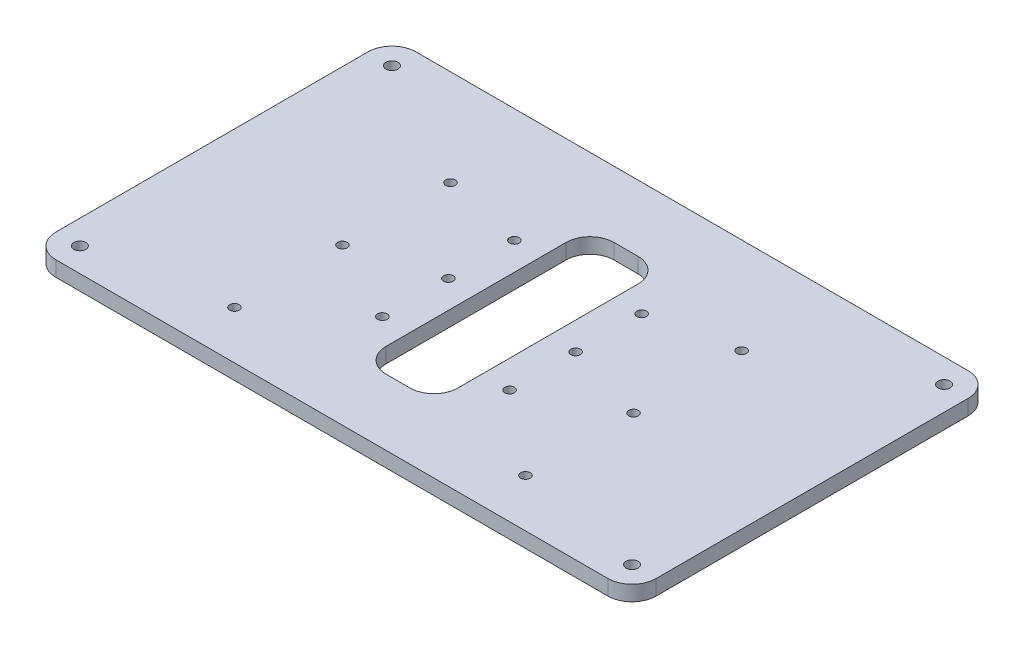
ISO-10303-21;
HEADER;
FILE_DESCRIPTION(('STEP AP214'),'2;1');
FILE_NAME('part.step','',(''),(''),'','','');
FILE_SCHEMA(('AUTOMOTIVE_DESIGN { 1 0 10303 214 1 1 1 1 }'));
ENDSEC;
DATA;
#1=APPLICATION_CONTEXT('core data for automotive mechanical design processes');
#2=APPLICATION_PROTOCOL_DEFINITION('international standard','automotive_design',2000,#1);
#3=PRODUCT_CONTEXT('',#1,'mechanical');
#4=PRODUCT('Part','Part','',(#3));
#5=PRODUCT_RELATED_PRODUCT_CATEGORY('part','',(#4));
#6=PRODUCT_DEFINITION_FORMATION('','',#4);
#7=PRODUCT_DEFINITION_CONTEXT('part definition',#1,'design');
#8=PRODUCT_DEFINITION('design','',#6,#7);
#9=PRODUCT_DEFINITION_SHAPE('','',#8);
#10=(LENGTH_UNIT() NAMED_UNIT(*) SI_UNIT(.MILLI.,.METRE.));
#11=(NAMED_UNIT(*) PLANE_ANGLE_UNIT() SI_UNIT($,.RADIAN.));
#12=(NAMED_UNIT(*) SI_UNIT($,.STERADIAN.) SOLID_ANGLE_UNIT());
#13=UNCERTAINTY_MEASURE_WITH_UNIT(LENGTH_MEASURE(1.E-05),#10,'distance_accuracy_value','');
#14=(GEOMETRIC_REPRESENTATION_CONTEXT(3) GLOBAL_UNCERTAINTY_ASSIGNED_CONTEXT((#13)) GLOBAL_UNIT_ASSIGNED_CONTEXT((#10,
#11,#12)) REPRESENTATION_CONTEXT('',''));
#15=CARTESIAN_POINT('',(0.,0.,0.));
#16=DIRECTION('',(0.,0.,1.));
#17=DIRECTION('',(1.,0.,0.));
#18=AXIS2_PLACEMENT_3D('',#15,#16,#17);
#19=CARTESIAN_POINT('',(-125.,6.35,-75.));
#20=DIRECTION('',(1.,0.,0.));
#21=DIRECTION('',(0.,0.,-1.));
#22=AXIS2_PLACEMENT_3D('',#19,#20,#21);
#23=PLANE('',#22);
#24=DIRECTION('',(0.,0.,1.));
#25=VECTOR('',#24,1.);
#26=CARTESIAN_POINT('',(-125.,0.,-75.));
#27=LINE('',#26,#25);
#28=CARTESIAN_POINT('',(-125.,0.,-65.));
#29=VERTEX_POINT('',#28);
#30=CARTESIAN_POINT('',(-125.,0.,65.));
#31=VERTEX_POINT('',#30);
#32=EDGE_CURVE('E195',#29,#31,#27,.T.);
#33=ORIENTED_EDGE('',*,*,#32,.T.);
#34=DIRECTION('',(0.,-1.,0.));
#35=VECTOR('',#34,1.);
#36=CARTESIAN_POINT('',(-125.,6.35,65.));
#37=LINE('',#36,#35);
#38=CARTESIAN_POINT('',(-125.,6.35,65.));
#39=VERTEX_POINT('',#38);
#40=EDGE_CURVE('E235',#31,#39,#37,.F.);
#41=ORIENTED_EDGE('',*,*,#40,.T.);
#42=DIRECTION('',(0.,0.,1.));
#43=VECTOR('',#42,1.);
#44=CARTESIAN_POINT('',(-125.,6.35,-75.));
#45=LINE('',#44,#43);
#46=CARTESIAN_POINT('',(-125.,6.35,-65.));
#47=VERTEX_POINT('',#46);
#48=EDGE_CURVE('E184',#47,#39,#45,.T.);
#49=ORIENTED_EDGE('',*,*,#48,.F.);
#50=DIRECTION('',(0.,-1.,0.));
#51=VECTOR('',#50,1.);
#52=CARTESIAN_POINT('',(-125.,6.35,-65.));
#53=LINE('',#52,#51);
#54=EDGE_CURVE('E232',#47,#29,#53,.T.);
#55=ORIENTED_EDGE('',*,*,#54,.T.);
#56=EDGE_LOOP('',(#33,#41,#49,#55));
#57=FACE_BOUND('',#56,.T.);
#58=ADVANCED_FACE('F33',(#57),#23,.F.);
#59=CARTESIAN_POINT('',(-125.,6.35,75.));
#60=DIRECTION('',(0.,0.,-1.));
#61=DIRECTION('',(-1.,0.,0.));
#62=AXIS2_PLACEMENT_3D('',#59,#60,#61);
#63=PLANE('',#62);
#64=DIRECTION('',(1.,0.,0.));
#65=VECTOR('',#64,1.);
#66=CARTESIAN_POINT('',(-125.,6.35,75.));
#67=LINE('',#66,#65);
#68=CARTESIAN_POINT('',(-115.,6.35,75.));
#69=VERTEX_POINT('',#68);
#70=CARTESIAN_POINT('',(115.,6.35,75.));
#71=VERTEX_POINT('',#70);
#72=EDGE_CURVE('E187',#69,#71,#67,.T.);
#73=ORIENTED_EDGE('',*,*,#72,.F.);
#74=DIRECTION('',(0.,-1.,0.));
#75=VECTOR('',#74,1.);
#76=CARTESIAN_POINT('',(-115.,6.35,75.));
#77=LINE('',#76,#75);
#78=CARTESIAN_POINT('',(-115.,0.,75.));
#79=VERTEX_POINT('',#78);
#80=EDGE_CURVE('E221',#69,#79,#77,.T.);
#81=ORIENTED_EDGE('',*,*,#80,.T.);
#82=DIRECTION('',(1.,0.,0.));
#83=VECTOR('',#82,1.);
#84=CARTESIAN_POINT('',(-125.,0.,75.));
#85=LINE('',#84,#83);
#86=CARTESIAN_POINT('',(115.,0.,75.));
#87=VERTEX_POINT('',#86);
#88=EDGE_CURVE('E198',#79,#87,#85,.T.);
#89=ORIENTED_EDGE('',*,*,#88,.T.);
#90=DIRECTION('',(0.,-1.,0.));
#91=VECTOR('',#90,1.);
#92=CARTESIAN_POINT('',(115.,6.35,75.));
#93=LINE('',#92,#91);
#94=EDGE_CURVE('E219',#87,#71,#93,.F.);
#95=ORIENTED_EDGE('',*,*,#94,.T.);
#96=EDGE_LOOP('',(#73,#81,#89,#95));
#97=FACE_BOUND('',#96,.T.);
#98=ADVANCED_FACE('F305',(#97),#63,.F.);
#99=CARTESIAN_POINT('',(125.,6.35,-75.));
#100=DIRECTION('',(-1.,0.,0.));
#101=DIRECTION('',(0.,0.,1.));
#102=AXIS2_PLACEMENT_3D('',#99,#100,#101);
#103=PLANE('',#102);
#104=DIRECTION('',(0.,0.,-1.));
#105=VECTOR('',#104,1.);
#106=CARTESIAN_POINT('',(125.,0.,-75.));
#107=LINE('',#106,#105);
#108=CARTESIAN_POINT('',(125.,0.,65.));
#109=VERTEX_POINT('',#108);
#110=CARTESIAN_POINT('',(125.,0.,-65.));
#111=VERTEX_POINT('',#110);
#112=EDGE_CURVE('E201',#109,#111,#107,.T.);
#113=ORIENTED_EDGE('',*,*,#112,.T.);
#114=DIRECTION('',(0.,-1.,0.));
#115=VECTOR('',#114,1.);
#116=CARTESIAN_POINT('',(125.,6.35,-65.));
#117=LINE('',#116,#115);
#118=CARTESIAN_POINT('',(125.,6.35,-65.));
#119=VERTEX_POINT('',#118);
#120=EDGE_CURVE('E158',#111,#119,#117,.F.);
#121=ORIENTED_EDGE('',*,*,#120,.T.);
#122=DIRECTION('',(0.,0.,-1.));
#123=VECTOR('',#122,1.);
#124=CARTESIAN_POINT('',(125.,6.35,-75.));
#125=LINE('',#124,#123);
#126=CARTESIAN_POINT('',(125.,6.35,65.));
#127=VERTEX_POINT('',#126);
#128=EDGE_CURVE('E191',#127,#119,#125,.T.);
#129=ORIENTED_EDGE('',*,*,#128,.F.);
#130=DIRECTION('',(0.,-1.,0.));
#131=VECTOR('',#130,1.);
#132=CARTESIAN_POINT('',(125.,6.35,65.));
#133=LINE('',#132,#131);
#134=EDGE_CURVE('E248',#127,#109,#133,.T.);
#135=ORIENTED_EDGE('',*,*,#134,.T.);
#136=EDGE_LOOP('',(#113,#121,#129,#135));
#137=FACE_BOUND('',#136,.T.);
#138=ADVANCED_FACE('F312',(#137),#103,.F.);
#139=CARTESIAN_POINT('',(-125.,6.35,-75.));
#140=DIRECTION('',(0.,0.,1.));
#141=DIRECTION('',(1.,0.,0.));
#142=AXIS2_PLACEMENT_3D('',#139,#140,#141);
#143=PLANE('',#142);
#144=DIRECTION('',(-1.,0.,0.));
#145=VECTOR('',#144,1.);
#146=CARTESIAN_POINT('',(-125.,0.,-75.));
#147=LINE('',#146,#145);
#148=CARTESIAN_POINT('',(115.,0.,-75.));
#149=VERTEX_POINT('',#148);
#150=CARTESIAN_POINT('',(-115.,0.,-75.));
#151=VERTEX_POINT('',#150);
#152=EDGE_CURVE('E188',#149,#151,#147,.T.);
#153=ORIENTED_EDGE('',*,*,#152,.T.);
#154=DIRECTION('',(0.,-1.,0.));
#155=VECTOR('',#154,1.);
#156=CARTESIAN_POINT('',(-115.,6.35,-75.));
#157=LINE('',#156,#155);
#158=CARTESIAN_POINT('',(-115.,6.35,-75.));
#159=VERTEX_POINT('',#158);
#160=EDGE_CURVE('E48',#151,#159,#157,.F.);
#161=ORIENTED_EDGE('',*,*,#160,.T.);
#162=DIRECTION('',(-1.,0.,0.));
#163=VECTOR('',#162,1.);
#164=CARTESIAN_POINT('',(-125.,6.35,-75.));
#165=LINE('',#164,#163);
#166=CARTESIAN_POINT('',(115.,6.35,-75.));
#167=VERTEX_POINT('',#166);
#168=EDGE_CURVE('E193',#167,#159,#165,.T.);
#169=ORIENTED_EDGE('',*,*,#168,.F.);
#170=DIRECTION('',(0.,-1.,0.));
#171=VECTOR('',#170,1.);
#172=CARTESIAN_POINT('',(115.,6.35,-75.));
#173=LINE('',#172,#171);
#174=EDGE_CURVE('E244',#167,#149,#173,.T.);
#175=ORIENTED_EDGE('',*,*,#174,.T.);
#176=EDGE_LOOP('',(#153,#161,#169,#175));
#177=FACE_BOUND('',#176,.T.);
#178=ADVANCED_FACE('F346',(#177),#143,.F.);
#179=CARTESIAN_POINT('',(0.,6.35,0.));
#180=DIRECTION('',(0.,1.,0.));
#181=DIRECTION('',(0.,0.,1.));
#182=AXIS2_PLACEMENT_3D('',#179,#180,#181);
#183=PLANE('',#182);
#184=CARTESIAN_POINT('',(60.62,6.35,55.));
#185=DIRECTION('',(0.,1.,0.));
#186=DIRECTION('',(0.,0.,1.));
#187=AXIS2_PLACEMENT_3D('',#184,#185,#186);
#188=CIRCLE('',#187,1.99999999999999);
#189=CARTESIAN_POINT('',(60.62,6.35,57.));
#190=VERTEX_POINT('',#189);
#191=EDGE_CURVE('E595',#190,#190,#188,.T.);
#192=ORIENTED_EDGE('',*,*,#191,.F.);
#193=EDGE_LOOP('',(#192));
#194=FACE_BOUND('',#193,.T.);
#195=CARTESIAN_POINT('',(-26.5,6.35,-27.5));
#196=DIRECTION('',(0.,1.,0.));
#197=DIRECTION('',(0.,0.,1.));
#198=AXIS2_PLACEMENT_3D('',#195,#196,#197);
#199=CIRCLE('',#198,2.);
#200=CARTESIAN_POINT('',(-26.5,6.35,-25.5));
#201=VERTEX_POINT('',#200);
#202=EDGE_CURVE('E601',#201,#201,#199,.T.);
#203=ORIENTED_EDGE('',*,*,#202,.F.);
#204=EDGE_LOOP('',(#203));
#205=FACE_BOUND('',#204,.T.);
#206=CARTESIAN_POINT('',(-26.5,6.35,0.));
#207=DIRECTION('',(0.,1.,0.));
#208=DIRECTION('',(0.,0.,1.));
#209=AXIS2_PLACEMENT_3D('',#206,#207,#208);
#210=CIRCLE('',#209,2.);
#211=CARTESIAN_POINT('',(-26.5,6.35,2.));
#212=VERTEX_POINT('',#211);
#213=EDGE_CURVE('E713',#212,#212,#210,.T.);
#214=ORIENTED_EDGE('',*,*,#213,.F.);
#215=EDGE_LOOP('',(#214));
#216=FACE_BOUND('',#215,.T.);
#217=CARTESIAN_POINT('',(26.5,6.35,0.));
#218=DIRECTION('',(0.,1.,0.));
#219=DIRECTION('',(0.,0.,1.));
#220=AXIS2_PLACEMENT_3D('',#217,#218,#219);
#221=CIRCLE('',#220,2.);
#222=CARTESIAN_POINT('',(26.5,6.35,2.));
#223=VERTEX_POINT('',#222);
#224=EDGE_CURVE('E718',#223,#223,#221,.T.);
#225=ORIENTED_EDGE('',*,*,#224,.F.);
#226=EDGE_LOOP('',(#225));
#227=FACE_BOUND('',#226,.T.);
#228=CARTESIAN_POINT('',(60.62,6.35,9.99999999999999));
#229=DIRECTION('',(0.,1.,0.));
#230=DIRECTION('',(0.,0.,1.));
#231=AXIS2_PLACEMENT_3D('',#228,#229,#230);
#232=CIRCLE('',#231,1.99999999999999);
#233=CARTESIAN_POINT('',(60.62,6.35,12.));
#234=VERTEX_POINT('',#233);
#235=EDGE_CURVE('E598',#234,#234,#232,.T.);
#236=ORIENTED_EDGE('',*,*,#235,.F.);
#237=EDGE_LOOP('',(#236));
#238=FACE_BOUND('',#237,.T.);
#239=CARTESIAN_POINT('',(60.62,6.35,-35.));
#240=DIRECTION('',(0.,1.,0.));
#241=DIRECTION('',(0.,0.,1.));
#242=AXIS2_PLACEMENT_3D('',#239,#240,#241);
#243=CIRCLE('',#242,1.99999999999999);
#244=CARTESIAN_POINT('',(60.62,6.35,-33.));
#245=VERTEX_POINT('',#244);
#246=EDGE_CURVE('E624',#245,#245,#243,.T.);
#247=ORIENTED_EDGE('',*,*,#246,.F.);
#248=EDGE_LOOP('',(#247));
#249=FACE_BOUND('',#248,.T.);
#250=CARTESIAN_POINT('',(-60.62,6.35,55.));
#251=DIRECTION('',(0.,1.,0.));
#252=DIRECTION('',(0.,0.,1.));
#253=AXIS2_PLACEMENT_3D('',#250,#251,#252);
#254=CIRCLE('',#253,2.);
#255=CARTESIAN_POINT('',(-60.62,6.35,57.));
#256=VERTEX_POINT('',#255);
#257=EDGE_CURVE('E618',#256,#256,#254,.T.);
#258=ORIENTED_EDGE('',*,*,#257,.F.);
#259=EDGE_LOOP('',(#258));
#260=FACE_BOUND('',#259,.T.);
#261=CARTESIAN_POINT('',(-60.62,6.35,-35.));
#262=DIRECTION('',(0.,1.,0.));
#263=DIRECTION('',(0.,0.,1.));
#264=AXIS2_PLACEMENT_3D('',#261,#262,#263);
#265=CIRCLE('',#264,2.);
#266=CARTESIAN_POINT('',(-60.62,6.35,-33.));
#267=VERTEX_POINT('',#266);
#268=EDGE_CURVE('E612',#267,#267,#265,.T.);
#269=ORIENTED_EDGE('',*,*,#268,.F.);
#270=EDGE_LOOP('',(#269));
#271=FACE_BOUND('',#270,.T.);
#272=CARTESIAN_POINT('',(-26.5,6.35,27.5));
#273=DIRECTION('',(0.,1.,0.));
#274=DIRECTION('',(0.,0.,1.));
#275=AXIS2_PLACEMENT_3D('',#272,#273,#274);
#276=CIRCLE('',#275,2.);
#277=CARTESIAN_POINT('',(-26.5,6.35,29.5));
#278=VERTEX_POINT('',#277);
#279=EDGE_CURVE('E696',#278,#278,#276,.T.);
#280=ORIENTED_EDGE('',*,*,#279,.F.);
#281=EDGE_LOOP('',(#280));
#282=FACE_BOUND('',#281,.T.);
#283=CARTESIAN_POINT('',(26.5,6.35,27.5));
#284=DIRECTION('',(0.,1.,0.));
#285=DIRECTION('',(0.,0.,1.));
#286=AXIS2_PLACEMENT_3D('',#283,#284,#285);
#287=CIRCLE('',#286,2.);
#288=CARTESIAN_POINT('',(26.5,6.35,29.5));
#289=VERTEX_POINT('',#288);
#290=EDGE_CURVE('E700',#289,#289,#287,.T.);
#291=ORIENTED_EDGE('',*,*,#290,.F.);
#292=EDGE_LOOP('',(#291));
#293=FACE_BOUND('',#292,.T.);
#294=CARTESIAN_POINT('',(26.5,6.35,-27.5));
#295=DIRECTION('',(0.,1.,0.));
#296=DIRECTION('',(0.,0.,1.));
#297=AXIS2_PLACEMENT_3D('',#294,#295,#296);
#298=CIRCLE('',#297,2.);
#299=CARTESIAN_POINT('',(26.5,6.35,-25.5));
#300=VERTEX_POINT('',#299);
#301=EDGE_CURVE('E703',#300,#300,#298,.T.);
#302=ORIENTED_EDGE('',*,*,#301,.F.);
#303=EDGE_LOOP('',(#302));
#304=FACE_BOUND('',#303,.T.);
#305=CARTESIAN_POINT('',(-60.62,6.35,9.99999999999999));
#306=DIRECTION('',(0.,1.,0.));
#307=DIRECTION('',(0.,0.,1.));
#308=AXIS2_PLACEMENT_3D('',#305,#306,#307);
#309=CIRCLE('',#308,2.);
#310=CARTESIAN_POINT('',(-60.62,6.35,12.));
#311=VERTEX_POINT('',#310);
#312=EDGE_CURVE('E611',#311,#311,#309,.T.);
#313=ORIENTED_EDGE('',*,*,#312,.F.);
#314=EDGE_LOOP('',(#313));
#315=FACE_BOUND('',#314,.T.);
#316=CARTESIAN_POINT('',(-115.,6.35,65.));
#317=DIRECTION('',(0.,1.,0.));
#318=DIRECTION('',(0.,0.,1.));
#319=AXIS2_PLACEMENT_3D('',#316,#317,#318);
#320=CIRCLE('',#319,2.50000000000001);
#321=CARTESIAN_POINT('',(-115.,6.35,67.5));
#322=VERTEX_POINT('',#321);
#323=EDGE_CURVE('E635',#322,#322,#320,.T.);
#324=ORIENTED_EDGE('',*,*,#323,.F.);
#325=EDGE_LOOP('',(#324));
#326=FACE_BOUND('',#325,.T.);
#327=CARTESIAN_POINT('',(115.,6.35,65.));
#328=DIRECTION('',(0.,1.,0.));
#329=DIRECTION('',(0.,0.,1.));
#330=AXIS2_PLACEMENT_3D('',#327,#328,#329);
#331=CIRCLE('',#330,2.50000000000001);
#332=CARTESIAN_POINT('',(115.,6.35,67.5));
#333=VERTEX_POINT('',#332);
#334=EDGE_CURVE('E652',#333,#333,#331,.T.);
#335=ORIENTED_EDGE('',*,*,#334,.F.);
#336=EDGE_LOOP('',(#335));
#337=FACE_BOUND('',#336,.T.);
#338=CARTESIAN_POINT('',(115.,6.35,-65.));
#339=DIRECTION('',(0.,1.,0.));
#340=DIRECTION('',(0.,0.,1.));
#341=AXIS2_PLACEMENT_3D('',#338,#339,#340);
#342=CIRCLE('',#341,2.5);
#343=CARTESIAN_POINT('',(115.,6.35,-62.5));
#344=VERTEX_POINT('',#343);
#345=EDGE_CURVE('E646',#344,#344,#342,.T.);
#346=ORIENTED_EDGE('',*,*,#345,.F.);
#347=EDGE_LOOP('',(#346));
#348=FACE_BOUND('',#347,.T.);
#349=CARTESIAN_POINT('',(-115.,6.35,-65.));
#350=DIRECTION('',(0.,1.,0.));
#351=DIRECTION('',(0.,0.,1.));
#352=AXIS2_PLACEMENT_3D('',#349,#350,#351);
#353=CIRCLE('',#352,2.50000000000001);
#354=CARTESIAN_POINT('',(-115.,6.35,-62.5));
#355=VERTEX_POINT('',#354);
#356=EDGE_CURVE('E640',#355,#355,#353,.T.);
#357=ORIENTED_EDGE('',*,*,#356,.F.);
#358=EDGE_LOOP('',(#357));
#359=FACE_BOUND('',#358,.T.);
#360=DIRECTION('',(0.,0.,1.));
#361=VECTOR('',#360,1.);
#362=CARTESIAN_POINT('',(-15.,6.35,-47.5));
#363=LINE('',#362,#361);
#364=CARTESIAN_POINT('',(-15.,6.35,-37.5));
#365=VERTEX_POINT('',#364);
#366=CARTESIAN_POINT('',(-15.,6.35,37.5));
#367=VERTEX_POINT('',#366);
#368=EDGE_CURVE('E261',#365,#367,#363,.T.);
#369=ORIENTED_EDGE('',*,*,#368,.F.);
#370=CARTESIAN_POINT('',(-5.,6.35,-37.5));
#371=DIRECTION('',(0.,1.,0.));
#372=DIRECTION('',(0.,0.,1.));
#373=AXIS2_PLACEMENT_3D('',#370,#371,#372);
#374=CIRCLE('',#373,10.);
#375=CARTESIAN_POINT('',(-5.,6.35,-47.5));
#376=VERTEX_POINT('',#375);
#377=EDGE_CURVE('E173',#365,#376,#374,.F.);
#378=ORIENTED_EDGE('',*,*,#377,.T.);
#379=DIRECTION('',(-1.,0.,0.));
#380=VECTOR('',#379,1.);
#381=CARTESIAN_POINT('',(-15.,6.35,-47.5));
#382=LINE('',#381,#380);
#383=CARTESIAN_POINT('',(4.99999999999999,6.35,-47.5));
#384=VERTEX_POINT('',#383);
#385=EDGE_CURVE('E164',#384,#376,#382,.T.);
#386=ORIENTED_EDGE('',*,*,#385,.F.);
#387=CARTESIAN_POINT('',(4.99999999999999,6.35,-37.5));
#388=DIRECTION('',(0.,1.,0.));
#389=DIRECTION('',(0.,0.,1.));
#390=AXIS2_PLACEMENT_3D('',#387,#388,#389);
#391=CIRCLE('',#390,10.);
#392=CARTESIAN_POINT('',(15.,6.35,-37.5));
#393=VERTEX_POINT('',#392);
#394=EDGE_CURVE('E147',#384,#393,#391,.F.);
#395=ORIENTED_EDGE('',*,*,#394,.T.);
#396=DIRECTION('',(0.,0.,-1.));
#397=VECTOR('',#396,1.);
#398=CARTESIAN_POINT('',(15.,6.35,-47.5));
#399=LINE('',#398,#397);
#400=CARTESIAN_POINT('',(15.,6.35,37.5));
#401=VERTEX_POINT('',#400);
#402=EDGE_CURVE('E175',#401,#393,#399,.T.);
#403=ORIENTED_EDGE('',*,*,#402,.F.);
#404=CARTESIAN_POINT('',(5.,6.35,37.5));
#405=DIRECTION('',(0.,1.,0.));
#406=DIRECTION('',(0.,0.,1.));
#407=AXIS2_PLACEMENT_3D('',#404,#405,#406);
#408=CIRCLE('',#407,10.);
#409=CARTESIAN_POINT('',(5.,6.35,47.5));
#410=VERTEX_POINT('',#409);
#411=EDGE_CURVE('E256',#401,#410,#408,.F.);
#412=ORIENTED_EDGE('',*,*,#411,.T.);
#413=DIRECTION('',(1.,0.,0.));
#414=VECTOR('',#413,1.);
#415=CARTESIAN_POINT('',(-15.,6.35,47.5));
#416=LINE('',#415,#414);
#417=CARTESIAN_POINT('',(-5.,6.35,47.5));
#418=VERTEX_POINT('',#417);
#419=EDGE_CURVE('E180',#418,#410,#416,.T.);
#420=ORIENTED_EDGE('',*,*,#419,.F.);
#421=CARTESIAN_POINT('',(-5.,6.35,37.5));
#422=DIRECTION('',(0.,1.,0.));
#423=DIRECTION('',(0.,0.,1.));
#424=AXIS2_PLACEMENT_3D('',#421,#422,#423);
#425=CIRCLE('',#424,10.);
#426=EDGE_CURVE('E41',#418,#367,#425,.F.);
#427=ORIENTED_EDGE('',*,*,#426,.T.);
#428=EDGE_LOOP('',(#369,#378,#386,#395,#403,#412,#420,#427));
#429=FACE_BOUND('',#428,.T.);
#430=ORIENTED_EDGE('',*,*,#48,.T.);
#431=CARTESIAN_POINT('',(-115.,6.35,65.));
#432=DIRECTION('',(0.,1.,0.));
#433=DIRECTION('',(0.,0.,1.));
#434=AXIS2_PLACEMENT_3D('',#431,#432,#433);
#435=CIRCLE('',#434,10.);
#436=EDGE_CURVE('E242',#39,#69,#435,.T.);
#437=ORIENTED_EDGE('',*,*,#436,.T.);
#438=ORIENTED_EDGE('',*,*,#72,.T.);
#439=CARTESIAN_POINT('',(115.,6.35,65.));
#440=DIRECTION('',(0.,1.,0.));
#441=DIRECTION('',(0.,0.,1.));
#442=AXIS2_PLACEMENT_3D('',#439,#440,#441);
#443=CIRCLE('',#442,10.);
#444=EDGE_CURVE('E237',#71,#127,#443,.T.);
#445=ORIENTED_EDGE('',*,*,#444,.T.);
#446=ORIENTED_EDGE('',*,*,#128,.T.);
#447=CARTESIAN_POINT('',(115.,6.35,-65.));
#448=DIRECTION('',(0.,1.,0.));
#449=DIRECTION('',(0.,0.,1.));
#450=AXIS2_PLACEMENT_3D('',#447,#448,#449);
#451=CIRCLE('',#450,10.);
#452=EDGE_CURVE('E55',#119,#167,#451,.T.);
#453=ORIENTED_EDGE('',*,*,#452,.T.);
#454=ORIENTED_EDGE('',*,*,#168,.T.);
#455=CARTESIAN_POINT('',(-115.,6.35,-65.));
#456=DIRECTION('',(0.,1.,0.));
#457=DIRECTION('',(0.,0.,1.));
#458=AXIS2_PLACEMENT_3D('',#455,#456,#457);
#459=CIRCLE('',#458,10.);
#460=EDGE_CURVE('E240',#159,#47,#459,.T.);
#461=ORIENTED_EDGE('',*,*,#460,.T.);
#462=EDGE_LOOP('',(#430,#437,#438,#445,#446,#453,#454,#461));
#463=FACE_BOUND('',#462,.T.);
#464=ADVANCED_FACE('F172',(#194,#205,#216,#227,#238,#249,#260,#271,#282,#293,#304,#315,#326,
#337,#348,#359,#429,#463),#183,.T.);
#465=CARTESIAN_POINT('',(0.,0.,0.));
#466=DIRECTION('',(0.,1.,0.));
#467=DIRECTION('',(0.,0.,1.));
#468=AXIS2_PLACEMENT_3D('',#465,#466,#467);
#469=PLANE('',#468);
#470=CARTESIAN_POINT('',(60.62,0.,55.));
#471=DIRECTION('',(0.,1.,0.));
#472=DIRECTION('',(0.,0.,1.));
#473=AXIS2_PLACEMENT_3D('',#470,#471,#472);
#474=CIRCLE('',#473,1.99999999999999);
#475=CARTESIAN_POINT('',(60.62,0.,57.));
#476=VERTEX_POINT('',#475);
#477=EDGE_CURVE('E592',#476,#476,#474,.T.);
#478=ORIENTED_EDGE('',*,*,#477,.T.);
#479=EDGE_LOOP('',(#478));
#480=FACE_BOUND('',#479,.T.);
#481=CARTESIAN_POINT('',(-26.5,0.,-27.5));
#482=DIRECTION('',(0.,1.,0.));
#483=DIRECTION('',(0.,0.,1.));
#484=AXIS2_PLACEMENT_3D('',#481,#482,#483);
#485=CIRCLE('',#484,2.);
#486=CARTESIAN_POINT('',(-26.5,0.,-25.5));
#487=VERTEX_POINT('',#486);
#488=EDGE_CURVE('E596',#487,#487,#485,.T.);
#489=ORIENTED_EDGE('',*,*,#488,.T.);
#490=EDGE_LOOP('',(#489));
#491=FACE_BOUND('',#490,.T.);
#492=CARTESIAN_POINT('',(-26.5,0.,0.));
#493=DIRECTION('',(0.,1.,0.));
#494=DIRECTION('',(0.,0.,1.));
#495=AXIS2_PLACEMENT_3D('',#492,#493,#494);
#496=CIRCLE('',#495,2.);
#497=CARTESIAN_POINT('',(-26.5,0.,2.));
#498=VERTEX_POINT('',#497);
#499=EDGE_CURVE('E607',#498,#498,#496,.T.);
#500=ORIENTED_EDGE('',*,*,#499,.T.);
#501=EDGE_LOOP('',(#500));
#502=FACE_BOUND('',#501,.T.);
#503=CARTESIAN_POINT('',(26.5,0.,0.));
#504=DIRECTION('',(0.,1.,0.));
#505=DIRECTION('',(0.,0.,1.));
#506=AXIS2_PLACEMENT_3D('',#503,#504,#505);
#507=CIRCLE('',#506,2.);
#508=CARTESIAN_POINT('',(26.5,0.,2.));
#509=VERTEX_POINT('',#508);
#510=EDGE_CURVE('E716',#509,#509,#507,.T.);
#511=ORIENTED_EDGE('',*,*,#510,.T.);
#512=EDGE_LOOP('',(#511));
#513=FACE_BOUND('',#512,.T.);
#514=CARTESIAN_POINT('',(60.62,0.,9.99999999999999));
#515=DIRECTION('',(0.,1.,0.));
#516=DIRECTION('',(0.,0.,1.));
#517=AXIS2_PLACEMENT_3D('',#514,#515,#516);
#518=CIRCLE('',#517,1.99999999999999);
#519=CARTESIAN_POINT('',(60.62,0.,12.));
#520=VERTEX_POINT('',#519);
#521=EDGE_CURVE('E627',#520,#520,#518,.T.);
#522=ORIENTED_EDGE('',*,*,#521,.T.);
#523=EDGE_LOOP('',(#522));
#524=FACE_BOUND('',#523,.T.);
#525=CARTESIAN_POINT('',(60.62,0.,-35.));
#526=DIRECTION('',(0.,1.,0.));
#527=DIRECTION('',(0.,0.,1.));
#528=AXIS2_PLACEMENT_3D('',#525,#526,#527);
#529=CIRCLE('',#528,1.99999999999999);
#530=CARTESIAN_POINT('',(60.62,0.,-33.));
#531=VERTEX_POINT('',#530);
#532=EDGE_CURVE('E621',#531,#531,#529,.T.);
#533=ORIENTED_EDGE('',*,*,#532,.T.);
#534=EDGE_LOOP('',(#533));
#535=FACE_BOUND('',#534,.T.);
#536=CARTESIAN_POINT('',(-60.62,0.,55.));
#537=DIRECTION('',(0.,1.,0.));
#538=DIRECTION('',(0.,0.,1.));
#539=AXIS2_PLACEMENT_3D('',#536,#537,#538);
#540=CIRCLE('',#539,2.);
#541=CARTESIAN_POINT('',(-60.62,0.,57.));
#542=VERTEX_POINT('',#541);
#543=EDGE_CURVE('E615',#542,#542,#540,.T.);
#544=ORIENTED_EDGE('',*,*,#543,.T.);
#545=EDGE_LOOP('',(#544));
#546=FACE_BOUND('',#545,.T.);
#547=CARTESIAN_POINT('',(-60.62,0.,-35.));
#548=DIRECTION('',(0.,1.,0.));
#549=DIRECTION('',(0.,0.,1.));
#550=AXIS2_PLACEMENT_3D('',#547,#548,#549);
#551=CIRCLE('',#550,2.);
#552=CARTESIAN_POINT('',(-60.62,0.,-33.));
#553=VERTEX_POINT('',#552);
#554=EDGE_CURVE('E608',#553,#553,#551,.T.);
#555=ORIENTED_EDGE('',*,*,#554,.T.);
#556=EDGE_LOOP('',(#555));
#557=FACE_BOUND('',#556,.T.);
#558=CARTESIAN_POINT('',(-26.5,0.,27.5));
#559=DIRECTION('',(0.,1.,0.));
#560=DIRECTION('',(0.,0.,1.));
#561=AXIS2_PLACEMENT_3D('',#558,#559,#560);
#562=CIRCLE('',#561,2.);
#563=CARTESIAN_POINT('',(-26.5,0.,29.5));
#564=VERTEX_POINT('',#563);
#565=EDGE_CURVE('E720',#564,#564,#562,.T.);
#566=ORIENTED_EDGE('',*,*,#565,.T.);
#567=EDGE_LOOP('',(#566));
#568=FACE_BOUND('',#567,.T.);
#569=CARTESIAN_POINT('',(26.5,0.,27.5));
#570=DIRECTION('',(0.,1.,0.));
#571=DIRECTION('',(0.,0.,1.));
#572=AXIS2_PLACEMENT_3D('',#569,#570,#571);
#573=CIRCLE('',#572,2.);
#574=CARTESIAN_POINT('',(26.5,0.,29.5));
#575=VERTEX_POINT('',#574);
#576=EDGE_CURVE('E727',#575,#575,#573,.T.);
#577=ORIENTED_EDGE('',*,*,#576,.T.);
#578=EDGE_LOOP('',(#577));
#579=FACE_BOUND('',#578,.T.);
#580=CARTESIAN_POINT('',(26.5,0.,-27.5));
#581=DIRECTION('',(0.,1.,0.));
#582=DIRECTION('',(0.,0.,1.));
#583=AXIS2_PLACEMENT_3D('',#580,#581,#582);
#584=CIRCLE('',#583,2.);
#585=CARTESIAN_POINT('',(26.5,0.,-25.5));
#586=VERTEX_POINT('',#585);
#587=EDGE_CURVE('E705',#586,#586,#584,.T.);
#588=ORIENTED_EDGE('',*,*,#587,.T.);
#589=EDGE_LOOP('',(#588));
#590=FACE_BOUND('',#589,.T.);
#591=CARTESIAN_POINT('',(-60.62,0.,9.99999999999999));
#592=DIRECTION('',(0.,1.,0.));
#593=DIRECTION('',(0.,0.,1.));
#594=AXIS2_PLACEMENT_3D('',#591,#592,#593);
#595=CIRCLE('',#594,2.);
#596=CARTESIAN_POINT('',(-60.62,0.,12.));
#597=VERTEX_POINT('',#596);
#598=EDGE_CURVE('E632',#597,#597,#595,.T.);
#599=ORIENTED_EDGE('',*,*,#598,.T.);
#600=EDGE_LOOP('',(#599));
#601=FACE_BOUND('',#600,.T.);
#602=CARTESIAN_POINT('',(-115.,0.,65.));
#603=DIRECTION('',(0.,1.,0.));
#604=DIRECTION('',(0.,0.,1.));
#605=AXIS2_PLACEMENT_3D('',#602,#603,#604);
#606=CIRCLE('',#605,2.50000000000001);
#607=CARTESIAN_POINT('',(-115.,0.,67.5));
#608=VERTEX_POINT('',#607);
#609=EDGE_CURVE('E655',#608,#608,#606,.T.);
#610=ORIENTED_EDGE('',*,*,#609,.T.);
#611=EDGE_LOOP('',(#610));
#612=FACE_BOUND('',#611,.T.);
#613=CARTESIAN_POINT('',(115.,0.,65.));
#614=DIRECTION('',(0.,1.,0.));
#615=DIRECTION('',(0.,0.,1.));
#616=AXIS2_PLACEMENT_3D('',#613,#614,#615);
#617=CIRCLE('',#616,2.50000000000001);
#618=CARTESIAN_POINT('',(115.,0.,67.5));
#619=VERTEX_POINT('',#618);
#620=EDGE_CURVE('E649',#619,#619,#617,.T.);
#621=ORIENTED_EDGE('',*,*,#620,.T.);
#622=EDGE_LOOP('',(#621));
#623=FACE_BOUND('',#622,.T.);
#624=CARTESIAN_POINT('',(115.,0.,-65.));
#625=DIRECTION('',(0.,1.,0.));
#626=DIRECTION('',(0.,0.,1.));
#627=AXIS2_PLACEMENT_3D('',#624,#625,#626);
#628=CIRCLE('',#627,2.5);
#629=CARTESIAN_POINT('',(115.,0.,-62.5));
#630=VERTEX_POINT('',#629);
#631=EDGE_CURVE('E643',#630,#630,#628,.T.);
#632=ORIENTED_EDGE('',*,*,#631,.T.);
#633=EDGE_LOOP('',(#632));
#634=FACE_BOUND('',#633,.T.);
#635=CARTESIAN_POINT('',(-115.,0.,-65.));
#636=DIRECTION('',(0.,1.,0.));
#637=DIRECTION('',(0.,0.,1.));
#638=AXIS2_PLACEMENT_3D('',#635,#636,#637);
#639=CIRCLE('',#638,2.50000000000001);
#640=CARTESIAN_POINT('',(-115.,0.,-62.5));
#641=VERTEX_POINT('',#640);
#642=EDGE_CURVE('E270',#641,#641,#639,.T.);
#643=ORIENTED_EDGE('',*,*,#642,.T.);
#644=EDGE_LOOP('',(#643));
#645=FACE_BOUND('',#644,.T.);
#646=DIRECTION('',(0.,0.,-1.));
#647=VECTOR('',#646,1.);
#648=CARTESIAN_POINT('',(15.,0.,-47.5));
#649=LINE('',#648,#647);
#650=CARTESIAN_POINT('',(15.,0.,37.5));
#651=VERTEX_POINT('',#650);
#652=CARTESIAN_POINT('',(15.,0.,-37.5));
#653=VERTEX_POINT('',#652);
#654=EDGE_CURVE('E284',#651,#653,#649,.T.);
#655=ORIENTED_EDGE('',*,*,#654,.T.);
#656=CARTESIAN_POINT('',(4.99999999999999,0.,-37.5));
#657=DIRECTION('',(0.,1.,0.));
#658=DIRECTION('',(0.,0.,1.));
#659=AXIS2_PLACEMENT_3D('',#656,#657,#658);
#660=CIRCLE('',#659,10.);
#661=CARTESIAN_POINT('',(4.99999999999999,0.,-47.5));
#662=VERTEX_POINT('',#661);
#663=EDGE_CURVE('E157',#653,#662,#660,.T.);
#664=ORIENTED_EDGE('',*,*,#663,.T.);
#665=DIRECTION('',(-1.,0.,0.));
#666=VECTOR('',#665,1.);
#667=CARTESIAN_POINT('',(-15.,0.,-47.5));
#668=LINE('',#667,#666);
#669=CARTESIAN_POINT('',(-5.,0.,-47.5));
#670=VERTEX_POINT('',#669);
#671=EDGE_CURVE('E167',#662,#670,#668,.T.);
#672=ORIENTED_EDGE('',*,*,#671,.T.);
#673=CARTESIAN_POINT('',(-5.,0.,-37.5));
#674=DIRECTION('',(0.,1.,0.));
#675=DIRECTION('',(0.,0.,1.));
#676=AXIS2_PLACEMENT_3D('',#673,#674,#675);
#677=CIRCLE('',#676,10.);
#678=CARTESIAN_POINT('',(-15.,0.,-37.5));
#679=VERTEX_POINT('',#678);
#680=EDGE_CURVE('E254',#670,#679,#677,.T.);
#681=ORIENTED_EDGE('',*,*,#680,.T.);
#682=DIRECTION('',(0.,0.,1.));
#683=VECTOR('',#682,1.);
#684=CARTESIAN_POINT('',(-15.,0.,-47.5));
#685=LINE('',#684,#683);
#686=CARTESIAN_POINT('',(-15.,0.,37.5));
#687=VERTEX_POINT('',#686);
#688=EDGE_CURVE('E174',#679,#687,#685,.T.);
#689=ORIENTED_EDGE('',*,*,#688,.T.);
#690=CARTESIAN_POINT('',(-5.,0.,37.5));
#691=DIRECTION('',(0.,1.,0.));
#692=DIRECTION('',(0.,0.,1.));
#693=AXIS2_PLACEMENT_3D('',#690,#691,#692);
#694=CIRCLE('',#693,10.);
#695=CARTESIAN_POINT('',(-5.,0.,47.5));
#696=VERTEX_POINT('',#695);
#697=EDGE_CURVE('E11',#687,#696,#694,.T.);
#698=ORIENTED_EDGE('',*,*,#697,.T.);
#699=DIRECTION('',(1.,0.,0.));
#700=VECTOR('',#699,1.);
#701=CARTESIAN_POINT('',(-15.,0.,47.5));
#702=LINE('',#701,#700);
#703=CARTESIAN_POINT('',(5.,0.,47.5));
#704=VERTEX_POINT('',#703);
#705=EDGE_CURVE('E178',#696,#704,#702,.T.);
#706=ORIENTED_EDGE('',*,*,#705,.T.);
#707=CARTESIAN_POINT('',(5.,0.,37.5));
#708=DIRECTION('',(0.,1.,0.));
#709=DIRECTION('',(0.,0.,1.));
#710=AXIS2_PLACEMENT_3D('',#707,#708,#709);
#711=CIRCLE('',#710,10.);
#712=EDGE_CURVE('E258',#704,#651,#711,.T.);
#713=ORIENTED_EDGE('',*,*,#712,.T.);
#714=EDGE_LOOP('',(#655,#664,#672,#681,#689,#698,#706,#713));
#715=FACE_BOUND('',#714,.T.);
#716=ORIENTED_EDGE('',*,*,#88,.F.);
#717=CARTESIAN_POINT('',(-115.,0.,65.));
#718=DIRECTION('',(0.,1.,0.));
#719=DIRECTION('',(0.,0.,1.));
#720=AXIS2_PLACEMENT_3D('',#717,#718,#719);
#721=CIRCLE('',#720,10.);
#722=EDGE_CURVE('E230',#79,#31,#721,.F.);
#723=ORIENTED_EDGE('',*,*,#722,.T.);
#724=ORIENTED_EDGE('',*,*,#32,.F.);
#725=CARTESIAN_POINT('',(-115.,0.,-65.));
#726=DIRECTION('',(0.,1.,0.));
#727=DIRECTION('',(0.,0.,1.));
#728=AXIS2_PLACEMENT_3D('',#725,#726,#727);
#729=CIRCLE('',#728,10.);
#730=EDGE_CURVE('E228',#29,#151,#729,.F.);
#731=ORIENTED_EDGE('',*,*,#730,.T.);
#732=ORIENTED_EDGE('',*,*,#152,.F.);
#733=CARTESIAN_POINT('',(115.,0.,-65.));
#734=DIRECTION('',(0.,1.,0.));
#735=DIRECTION('',(0.,0.,1.));
#736=AXIS2_PLACEMENT_3D('',#733,#734,#735);
#737=CIRCLE('',#736,10.);
#738=EDGE_CURVE('E226',#149,#111,#737,.F.);
#739=ORIENTED_EDGE('',*,*,#738,.T.);
#740=ORIENTED_EDGE('',*,*,#112,.F.);
#741=CARTESIAN_POINT('',(115.,0.,65.));
#742=DIRECTION('',(0.,1.,0.));
#743=DIRECTION('',(0.,0.,1.));
#744=AXIS2_PLACEMENT_3D('',#741,#742,#743);
#745=CIRCLE('',#744,10.);
#746=EDGE_CURVE('E224',#109,#87,#745,.F.);
#747=ORIENTED_EDGE('',*,*,#746,.T.);
#748=EDGE_LOOP('',(#716,#723,#724,#731,#732,#739,#740,#747));
#749=FACE_BOUND('',#748,.T.);
#750=ADVANCED_FACE('F278',(#480,#491,#502,#513,#524,#535,#546,#557,#568,#579,#590,#601,#612,
#623,#634,#645,#715,#749),#469,.F.);
#751=CARTESIAN_POINT('',(-15.,0.,-47.5));
#752=DIRECTION('',(-1.,0.,0.));
#753=DIRECTION('',(0.,0.,1.));
#754=AXIS2_PLACEMENT_3D('',#751,#752,#753);
#755=PLANE('',#754);
#756=ORIENTED_EDGE('',*,*,#688,.F.);
#757=DIRECTION('',(0.,1.,0.));
#758=VECTOR('',#757,1.);
#759=CARTESIAN_POINT('',(-15.,6.35,-37.5));
#760=LINE('',#759,#758);
#761=EDGE_CURVE('E211',#679,#365,#760,.T.);
#762=ORIENTED_EDGE('',*,*,#761,.T.);
#763=ORIENTED_EDGE('',*,*,#368,.T.);
#764=DIRECTION('',(0.,1.,0.));
#765=VECTOR('',#764,1.);
#766=CARTESIAN_POINT('',(-15.,0.,37.5));
#767=LINE('',#766,#765);
#768=EDGE_CURVE('E209',#367,#687,#767,.F.);
#769=ORIENTED_EDGE('',*,*,#768,.T.);
#770=EDGE_LOOP('',(#756,#762,#763,#769));
#771=FACE_BOUND('',#770,.T.);
#772=ADVANCED_FACE('F268',(#771),#755,.F.);
#773=CARTESIAN_POINT('',(-15.,0.,-47.5));
#774=DIRECTION('',(0.,0.,-1.));
#775=DIRECTION('',(-1.,0.,0.));
#776=AXIS2_PLACEMENT_3D('',#773,#774,#775);
#777=PLANE('',#776);
#778=ORIENTED_EDGE('',*,*,#671,.F.);
#779=DIRECTION('',(0.,1.,0.));
#780=VECTOR('',#779,1.);
#781=CARTESIAN_POINT('',(4.99999999999999,6.35,-47.5));
#782=LINE('',#781,#780);
#783=EDGE_CURVE('E151',#662,#384,#782,.T.);
#784=ORIENTED_EDGE('',*,*,#783,.T.);
#785=ORIENTED_EDGE('',*,*,#385,.T.);
#786=DIRECTION('',(0.,1.,0.));
#787=VECTOR('',#786,1.);
#788=CARTESIAN_POINT('',(-5.,0.,-47.5));
#789=LINE('',#788,#787);
#790=EDGE_CURVE('E169',#376,#670,#789,.F.);
#791=ORIENTED_EDGE('',*,*,#790,.T.);
#792=EDGE_LOOP('',(#778,#784,#785,#791));
#793=FACE_BOUND('',#792,.T.);
#794=ADVANCED_FACE('F163',(#793),#777,.F.);
#795=CARTESIAN_POINT('',(15.,0.,-47.5));
#796=DIRECTION('',(1.,0.,0.));
#797=DIRECTION('',(0.,0.,-1.));
#798=AXIS2_PLACEMENT_3D('',#795,#796,#797);
#799=PLANE('',#798);
#800=ORIENTED_EDGE('',*,*,#402,.T.);
#801=DIRECTION('',(0.,1.,0.));
#802=VECTOR('',#801,1.);
#803=CARTESIAN_POINT('',(15.,0.,-37.5));
#804=LINE('',#803,#802);
#805=EDGE_CURVE('E152',#393,#653,#804,.F.);
#806=ORIENTED_EDGE('',*,*,#805,.T.);
#807=ORIENTED_EDGE('',*,*,#654,.F.);
#808=DIRECTION('',(0.,1.,0.));
#809=VECTOR('',#808,1.);
#810=CARTESIAN_POINT('',(15.,6.35,37.5));
#811=LINE('',#810,#809);
#812=EDGE_CURVE('E168',#651,#401,#811,.T.);
#813=ORIENTED_EDGE('',*,*,#812,.T.);
#814=EDGE_LOOP('',(#800,#806,#807,#813));
#815=FACE_BOUND('',#814,.T.);
#816=ADVANCED_FACE('F294',(#815),#799,.F.);
#817=CARTESIAN_POINT('',(-15.,0.,47.5));
#818=DIRECTION('',(0.,0.,1.));
#819=DIRECTION('',(1.,0.,0.));
#820=AXIS2_PLACEMENT_3D('',#817,#818,#819);
#821=PLANE('',#820);
#822=ORIENTED_EDGE('',*,*,#419,.T.);
#823=DIRECTION('',(0.,1.,0.));
#824=VECTOR('',#823,1.);
#825=CARTESIAN_POINT('',(5.,0.,47.5));
#826=LINE('',#825,#824);
#827=EDGE_CURVE('E217',#410,#704,#826,.F.);
#828=ORIENTED_EDGE('',*,*,#827,.T.);
#829=ORIENTED_EDGE('',*,*,#705,.F.);
#830=DIRECTION('',(0.,1.,0.));
#831=VECTOR('',#830,1.);
#832=CARTESIAN_POINT('',(-5.,6.35,47.5));
#833=LINE('',#832,#831);
#834=EDGE_CURVE('E214',#696,#418,#833,.T.);
#835=ORIENTED_EDGE('',*,*,#834,.T.);
#836=EDGE_LOOP('',(#822,#828,#829,#835));
#837=FACE_BOUND('',#836,.T.);
#838=ADVANCED_FACE('F282',(#837),#821,.F.);
#839=CARTESIAN_POINT('',(-115.,0.,-65.));
#840=DIRECTION('',(0.,1.,0.));
#841=DIRECTION('',(0.,0.,1.));
#842=AXIS2_PLACEMENT_3D('',#839,#840,#841);
#843=CYLINDRICAL_SURFACE('',#842,2.50000000000001);
#844=ORIENTED_EDGE('',*,*,#642,.F.);
#845=EDGE_LOOP('',(#844));
#846=FACE_BOUND('',#845,.T.);
#847=ORIENTED_EDGE('',*,*,#356,.T.);
#848=EDGE_LOOP('',(#847));
#849=FACE_BOUND('',#848,.T.);
#850=ADVANCED_FACE('F301',(#846,#849),#843,.F.);
#851=CARTESIAN_POINT('',(115.,0.,-65.));
#852=DIRECTION('',(0.,1.,0.));
#853=DIRECTION('',(0.,0.,1.));
#854=AXIS2_PLACEMENT_3D('',#851,#852,#853);
#855=CYLINDRICAL_SURFACE('',#854,2.5);
#856=ORIENTED_EDGE('',*,*,#631,.F.);
#857=EDGE_LOOP('',(#856));
#858=FACE_BOUND('',#857,.T.);
#859=ORIENTED_EDGE('',*,*,#345,.T.);
#860=EDGE_LOOP('',(#859));
#861=FACE_BOUND('',#860,.T.);
#862=ADVANCED_FACE('F404',(#858,#861),#855,.F.);
#863=CARTESIAN_POINT('',(115.,0.,65.));
#864=DIRECTION('',(0.,1.,0.));
#865=DIRECTION('',(0.,0.,1.));
#866=AXIS2_PLACEMENT_3D('',#863,#864,#865);
#867=CYLINDRICAL_SURFACE('',#866,2.50000000000001);
#868=ORIENTED_EDGE('',*,*,#620,.F.);
#869=EDGE_LOOP('',(#868));
#870=FACE_BOUND('',#869,.T.);
#871=ORIENTED_EDGE('',*,*,#334,.T.);
#872=EDGE_LOOP('',(#871));
#873=FACE_BOUND('',#872,.T.);
#874=ADVANCED_FACE('F411',(#870,#873),#867,.F.);
#875=CARTESIAN_POINT('',(-115.,0.,65.));
#876=DIRECTION('',(0.,1.,0.));
#877=DIRECTION('',(0.,0.,1.));
#878=AXIS2_PLACEMENT_3D('',#875,#876,#877);
#879=CYLINDRICAL_SURFACE('',#878,2.50000000000001);
#880=ORIENTED_EDGE('',*,*,#609,.F.);
#881=EDGE_LOOP('',(#880));
#882=FACE_BOUND('',#881,.T.);
#883=ORIENTED_EDGE('',*,*,#323,.T.);
#884=EDGE_LOOP('',(#883));
#885=FACE_BOUND('',#884,.T.);
#886=ADVANCED_FACE('F320',(#882,#885),#879,.F.);
#887=CARTESIAN_POINT('',(4.99999999999999,0.,-37.5));
#888=DIRECTION('',(0.,-1.,0.));
#889=DIRECTION('',(0.,0.,-1.));
#890=AXIS2_PLACEMENT_3D('',#887,#888,#889);
#891=CYLINDRICAL_SURFACE('',#890,10.);
#892=ORIENTED_EDGE('',*,*,#663,.F.);
#893=ORIENTED_EDGE('',*,*,#805,.F.);
#894=ORIENTED_EDGE('',*,*,#394,.F.);
#895=ORIENTED_EDGE('',*,*,#783,.F.);
#896=EDGE_LOOP('',(#892,#893,#894,#895));
#897=FACE_BOUND('',#896,.T.);
#898=ADVANCED_FACE('F150',(#897),#891,.F.);
#899=CARTESIAN_POINT('',(-5.,0.,-37.5));
#900=DIRECTION('',(0.,-1.,0.));
#901=DIRECTION('',(0.,0.,-1.));
#902=AXIS2_PLACEMENT_3D('',#899,#900,#901);
#903=CYLINDRICAL_SURFACE('',#902,10.);
#904=ORIENTED_EDGE('',*,*,#680,.F.);
#905=ORIENTED_EDGE('',*,*,#790,.F.);
#906=ORIENTED_EDGE('',*,*,#377,.F.);
#907=ORIENTED_EDGE('',*,*,#761,.F.);
#908=EDGE_LOOP('',(#904,#905,#906,#907));
#909=FACE_BOUND('',#908,.T.);
#910=ADVANCED_FACE('F319',(#909),#903,.F.);
#911=CARTESIAN_POINT('',(5.,0.,37.5));
#912=DIRECTION('',(0.,-1.,0.));
#913=DIRECTION('',(0.,0.,-1.));
#914=AXIS2_PLACEMENT_3D('',#911,#912,#913);
#915=CYLINDRICAL_SURFACE('',#914,10.);
#916=ORIENTED_EDGE('',*,*,#712,.F.);
#917=ORIENTED_EDGE('',*,*,#827,.F.);
#918=ORIENTED_EDGE('',*,*,#411,.F.);
#919=ORIENTED_EDGE('',*,*,#812,.F.);
#920=EDGE_LOOP('',(#916,#917,#918,#919));
#921=FACE_BOUND('',#920,.T.);
#922=ADVANCED_FACE('F290',(#921),#915,.F.);
#923=CARTESIAN_POINT('',(-5.,0.,37.5));
#924=DIRECTION('',(0.,-1.,0.));
#925=DIRECTION('',(0.,0.,-1.));
#926=AXIS2_PLACEMENT_3D('',#923,#924,#925);
#927=CYLINDRICAL_SURFACE('',#926,10.);
#928=ORIENTED_EDGE('',*,*,#697,.F.);
#929=ORIENTED_EDGE('',*,*,#768,.F.);
#930=ORIENTED_EDGE('',*,*,#426,.F.);
#931=ORIENTED_EDGE('',*,*,#834,.F.);
#932=EDGE_LOOP('',(#928,#929,#930,#931));
#933=FACE_BOUND('',#932,.T.);
#934=ADVANCED_FACE('F273',(#933),#927,.F.);
#935=CARTESIAN_POINT('',(-115.,6.35,65.));
#936=DIRECTION('',(0.,-1.,0.));
#937=DIRECTION('',(0.,0.,-1.));
#938=AXIS2_PLACEMENT_3D('',#935,#936,#937);
#939=CYLINDRICAL_SURFACE('',#938,10.);
#940=ORIENTED_EDGE('',*,*,#436,.F.);
#941=ORIENTED_EDGE('',*,*,#40,.F.);
#942=ORIENTED_EDGE('',*,*,#722,.F.);
#943=ORIENTED_EDGE('',*,*,#80,.F.);
#944=EDGE_LOOP('',(#940,#941,#942,#943));
#945=FACE_BOUND('',#944,.T.);
#946=ADVANCED_FACE('F328',(#945),#939,.T.);
#947=CARTESIAN_POINT('',(-115.,6.35,-65.));
#948=DIRECTION('',(0.,-1.,0.));
#949=DIRECTION('',(0.,0.,-1.));
#950=AXIS2_PLACEMENT_3D('',#947,#948,#949);
#951=CYLINDRICAL_SURFACE('',#950,10.);
#952=ORIENTED_EDGE('',*,*,#460,.F.);
#953=ORIENTED_EDGE('',*,*,#160,.F.);
#954=ORIENTED_EDGE('',*,*,#730,.F.);
#955=ORIENTED_EDGE('',*,*,#54,.F.);
#956=EDGE_LOOP('',(#952,#953,#954,#955));
#957=FACE_BOUND('',#956,.T.);
#958=ADVANCED_FACE('F331',(#957),#951,.T.);
#959=CARTESIAN_POINT('',(115.,6.35,-65.));
#960=DIRECTION('',(0.,-1.,0.));
#961=DIRECTION('',(0.,0.,-1.));
#962=AXIS2_PLACEMENT_3D('',#959,#960,#961);
#963=CYLINDRICAL_SURFACE('',#962,10.);
#964=ORIENTED_EDGE('',*,*,#452,.F.);
#965=ORIENTED_EDGE('',*,*,#120,.F.);
#966=ORIENTED_EDGE('',*,*,#738,.F.);
#967=ORIENTED_EDGE('',*,*,#174,.F.);
#968=EDGE_LOOP('',(#964,#965,#966,#967));
#969=FACE_BOUND('',#968,.T.);
#970=ADVANCED_FACE('F334',(#969),#963,.T.);
#971=CARTESIAN_POINT('',(115.,6.35,65.));
#972=DIRECTION('',(0.,-1.,0.));
#973=DIRECTION('',(0.,0.,-1.));
#974=AXIS2_PLACEMENT_3D('',#971,#972,#973);
#975=CYLINDRICAL_SURFACE('',#974,10.);
#976=ORIENTED_EDGE('',*,*,#444,.F.);
#977=ORIENTED_EDGE('',*,*,#94,.F.);
#978=ORIENTED_EDGE('',*,*,#746,.F.);
#979=ORIENTED_EDGE('',*,*,#134,.F.);
#980=EDGE_LOOP('',(#976,#977,#978,#979));
#981=FACE_BOUND('',#980,.T.);
#982=ADVANCED_FACE('F35',(#981),#975,.T.);
#983=CARTESIAN_POINT('',(-60.62,0.,9.99999999999999));
#984=DIRECTION('',(0.,1.,0.));
#985=DIRECTION('',(0.,0.,1.));
#986=AXIS2_PLACEMENT_3D('',#983,#984,#985);
#987=CYLINDRICAL_SURFACE('',#986,2.);
#988=ORIENTED_EDGE('',*,*,#598,.F.);
#989=EDGE_LOOP('',(#988));
#990=FACE_BOUND('',#989,.T.);
#991=ORIENTED_EDGE('',*,*,#312,.T.);
#992=EDGE_LOOP('',(#991));
#993=FACE_BOUND('',#992,.T.);
#994=ADVANCED_FACE('F341',(#990,#993),#987,.F.);
#995=CARTESIAN_POINT('',(26.5,0.,-27.5));
#996=DIRECTION('',(0.,1.,0.));
#997=DIRECTION('',(0.,0.,1.));
#998=AXIS2_PLACEMENT_3D('',#995,#996,#997);
#999=CYLINDRICAL_SURFACE('',#998,2.);
#1000=ORIENTED_EDGE('',*,*,#587,.F.);
#1001=EDGE_LOOP('',(#1000));
#1002=FACE_BOUND('',#1001,.T.);
#1003=ORIENTED_EDGE('',*,*,#301,.T.);
#1004=EDGE_LOOP('',(#1003));
#1005=FACE_BOUND('',#1004,.T.);
#1006=ADVANCED_FACE('F475',(#1002,#1005),#999,.F.);
#1007=CARTESIAN_POINT('',(26.5,0.,27.5));
#1008=DIRECTION('',(0.,1.,0.));
#1009=DIRECTION('',(0.,0.,1.));
#1010=AXIS2_PLACEMENT_3D('',#1007,#1008,#1009);
#1011=CYLINDRICAL_SURFACE('',#1010,2.);
#1012=ORIENTED_EDGE('',*,*,#576,.F.);
#1013=EDGE_LOOP('',(#1012));
#1014=FACE_BOUND('',#1013,.T.);
#1015=ORIENTED_EDGE('',*,*,#290,.T.);
#1016=EDGE_LOOP('',(#1015));
#1017=FACE_BOUND('',#1016,.T.);
#1018=ADVANCED_FACE('F485',(#1014,#1017),#1011,.F.);
#1019=CARTESIAN_POINT('',(-26.5,0.,27.5));
#1020=DIRECTION('',(0.,1.,0.));
#1021=DIRECTION('',(0.,0.,1.));
#1022=AXIS2_PLACEMENT_3D('',#1019,#1020,#1021);
#1023=CYLINDRICAL_SURFACE('',#1022,2.);
#1024=ORIENTED_EDGE('',*,*,#565,.F.);
#1025=EDGE_LOOP('',(#1024));
#1026=FACE_BOUND('',#1025,.T.);
#1027=ORIENTED_EDGE('',*,*,#279,.T.);
#1028=EDGE_LOOP('',(#1027));
#1029=FACE_BOUND('',#1028,.T.);
#1030=ADVANCED_FACE('F495',(#1026,#1029),#1023,.F.);
#1031=CARTESIAN_POINT('',(-60.62,0.,-35.));
#1032=DIRECTION('',(0.,1.,0.));
#1033=DIRECTION('',(0.,0.,1.));
#1034=AXIS2_PLACEMENT_3D('',#1031,#1032,#1033);
#1035=CYLINDRICAL_SURFACE('',#1034,2.);
#1036=ORIENTED_EDGE('',*,*,#554,.F.);
#1037=EDGE_LOOP('',(#1036));
#1038=FACE_BOUND('',#1037,.T.);
#1039=ORIENTED_EDGE('',*,*,#268,.T.);
#1040=EDGE_LOOP('',(#1039));
#1041=FACE_BOUND('',#1040,.T.);
#1042=ADVANCED_FACE('F505',(#1038,#1041),#1035,.F.);
#1043=CARTESIAN_POINT('',(-60.62,0.,55.));
#1044=DIRECTION('',(0.,1.,0.));
#1045=DIRECTION('',(0.,0.,1.));
#1046=AXIS2_PLACEMENT_3D('',#1043,#1044,#1045);
#1047=CYLINDRICAL_SURFACE('',#1046,2.);
#1048=ORIENTED_EDGE('',*,*,#543,.F.);
#1049=EDGE_LOOP('',(#1048));
#1050=FACE_BOUND('',#1049,.T.);
#1051=ORIENTED_EDGE('',*,*,#257,.T.);
#1052=EDGE_LOOP('',(#1051));
#1053=FACE_BOUND('',#1052,.T.);
#1054=ADVANCED_FACE('F515',(#1050,#1053),#1047,.F.);
#1055=CARTESIAN_POINT('',(60.62,0.,-35.));
#1056=DIRECTION('',(0.,1.,0.));
#1057=DIRECTION('',(0.,0.,1.));
#1058=AXIS2_PLACEMENT_3D('',#1055,#1056,#1057);
#1059=CYLINDRICAL_SURFACE('',#1058,1.99999999999999);
#1060=ORIENTED_EDGE('',*,*,#532,.F.);
#1061=EDGE_LOOP('',(#1060));
#1062=FACE_BOUND('',#1061,.T.);
#1063=ORIENTED_EDGE('',*,*,#246,.T.);
#1064=EDGE_LOOP('',(#1063));
#1065=FACE_BOUND('',#1064,.T.);
#1066=ADVANCED_FACE('F525',(#1062,#1065),#1059,.F.);
#1067=CARTESIAN_POINT('',(60.62,0.,9.99999999999999));
#1068=DIRECTION('',(0.,1.,0.));
#1069=DIRECTION('',(0.,0.,1.));
#1070=AXIS2_PLACEMENT_3D('',#1067,#1068,#1069);
#1071=CYLINDRICAL_SURFACE('',#1070,1.99999999999999);
#1072=ORIENTED_EDGE('',*,*,#521,.F.);
#1073=EDGE_LOOP('',(#1072));
#1074=FACE_BOUND('',#1073,.T.);
#1075=ORIENTED_EDGE('',*,*,#235,.T.);
#1076=EDGE_LOOP('',(#1075));
#1077=FACE_BOUND('',#1076,.T.);
#1078=ADVANCED_FACE('F535',(#1074,#1077),#1071,.F.);
#1079=CARTESIAN_POINT('',(26.5,0.,0.));
#1080=DIRECTION('',(0.,1.,0.));
#1081=DIRECTION('',(0.,0.,1.));
#1082=AXIS2_PLACEMENT_3D('',#1079,#1080,#1081);
#1083=CYLINDRICAL_SURFACE('',#1082,2.);
#1084=ORIENTED_EDGE('',*,*,#510,.F.);
#1085=EDGE_LOOP('',(#1084));
#1086=FACE_BOUND('',#1085,.T.);
#1087=ORIENTED_EDGE('',*,*,#224,.T.);
#1088=EDGE_LOOP('',(#1087));
#1089=FACE_BOUND('',#1088,.T.);
#1090=ADVANCED_FACE('F545',(#1086,#1089),#1083,.F.);
#1091=CARTESIAN_POINT('',(-26.5,0.,0.));
#1092=DIRECTION('',(0.,1.,0.));
#1093=DIRECTION('',(0.,0.,1.));
#1094=AXIS2_PLACEMENT_3D('',#1091,#1092,#1093);
#1095=CYLINDRICAL_SURFACE('',#1094,2.);
#1096=ORIENTED_EDGE('',*,*,#499,.F.);
#1097=EDGE_LOOP('',(#1096));
#1098=FACE_BOUND('',#1097,.T.);
#1099=ORIENTED_EDGE('',*,*,#213,.T.);
#1100=EDGE_LOOP('',(#1099));
#1101=FACE_BOUND('',#1100,.T.);
#1102=ADVANCED_FACE('F555',(#1098,#1101),#1095,.F.);
#1103=CARTESIAN_POINT('',(-26.5,0.,-27.5));
#1104=DIRECTION('',(0.,1.,0.));
#1105=DIRECTION('',(0.,0.,1.));
#1106=AXIS2_PLACEMENT_3D('',#1103,#1104,#1105);
#1107=CYLINDRICAL_SURFACE('',#1106,2.);
#1108=ORIENTED_EDGE('',*,*,#488,.F.);
#1109=EDGE_LOOP('',(#1108));
#1110=FACE_BOUND('',#1109,.T.);
#1111=ORIENTED_EDGE('',*,*,#202,.T.);
#1112=EDGE_LOOP('',(#1111));
#1113=FACE_BOUND('',#1112,.T.);
#1114=ADVANCED_FACE('F565',(#1110,#1113),#1107,.F.);
#1115=CARTESIAN_POINT('',(60.62,0.,55.));
#1116=DIRECTION('',(0.,1.,0.));
#1117=DIRECTION('',(0.,0.,1.));
#1118=AXIS2_PLACEMENT_3D('',#1115,#1116,#1117);
#1119=CYLINDRICAL_SURFACE('',#1118,1.99999999999999);
#1120=ORIENTED_EDGE('',*,*,#477,.F.);
#1121=EDGE_LOOP('',(#1120));
#1122=FACE_BOUND('',#1121,.T.);
#1123=ORIENTED_EDGE('',*,*,#191,.T.);
#1124=EDGE_LOOP('',(#1123));
#1125=FACE_BOUND('',#1124,.T.);
#1126=ADVANCED_FACE('F575',(#1122,#1125),#1119,.F.);
#1127=CLOSED_SHELL('',(#58,#98,#138,#178,#464,#750,#772,#794,#816,#838,#850,#862,#874,#886,#898,
#910,#922,#934,#946,#958,#970,#982,#994,#1006,#1018,#1030,#1042,#1054,#1066,#1078,#1090,#1102,
#1114,#1126));
#1128=MANIFOLD_SOLID_BREP('B2',#1127);
#1129=ADVANCED_BREP_SHAPE_REPRESENTATION('',(#18,#1128),#14);
#1130=SHAPE_DEFINITION_REPRESENTATION(#9,#1129);
ENDSEC;
END-ISO-10303-21;
